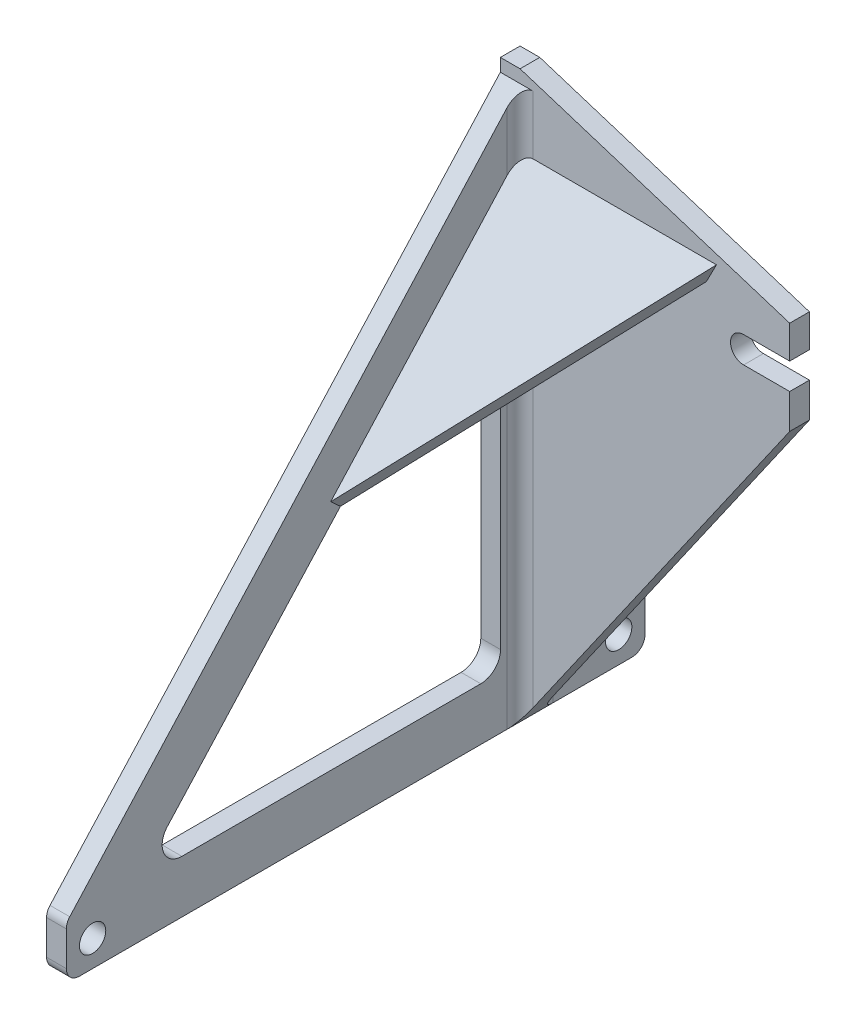
ISO-10303-21;
HEADER;
FILE_DESCRIPTION(('STEP AP214'),'2;1');
FILE_NAME('part.step','',(''),(''),'','','');
FILE_SCHEMA(('AUTOMOTIVE_DESIGN { 1 0 10303 214 1 1 1 1 }'));
ENDSEC;
DATA;
#1=APPLICATION_CONTEXT('core data for automotive mechanical design processes');
#2=APPLICATION_PROTOCOL_DEFINITION('international standard','automotive_design',2000,#1);
#3=PRODUCT_CONTEXT('',#1,'mechanical');
#4=PRODUCT('Part','Part','',(#3));
#5=PRODUCT_RELATED_PRODUCT_CATEGORY('part','',(#4));
#6=PRODUCT_DEFINITION_FORMATION('','',#4);
#7=PRODUCT_DEFINITION_CONTEXT('part definition',#1,'design');
#8=PRODUCT_DEFINITION('design','',#6,#7);
#9=PRODUCT_DEFINITION_SHAPE('','',#8);
#10=(LENGTH_UNIT() NAMED_UNIT(*) SI_UNIT(.MILLI.,.METRE.));
#11=(NAMED_UNIT(*) PLANE_ANGLE_UNIT() SI_UNIT($,.RADIAN.));
#12=(NAMED_UNIT(*) SI_UNIT($,.STERADIAN.) SOLID_ANGLE_UNIT());
#13=UNCERTAINTY_MEASURE_WITH_UNIT(LENGTH_MEASURE(1.E-05),#10,'distance_accuracy_value','');
#14=(GEOMETRIC_REPRESENTATION_CONTEXT(3) GLOBAL_UNCERTAINTY_ASSIGNED_CONTEXT((#13)) GLOBAL_UNIT_ASSIGNED_CONTEXT((#10,
#11,#12)) REPRESENTATION_CONTEXT('',''));
#15=CARTESIAN_POINT('',(0.,0.,0.));
#16=DIRECTION('',(0.,0.,1.));
#17=DIRECTION('',(1.,0.,0.));
#18=AXIS2_PLACEMENT_3D('',#15,#16,#17);
#19=CARTESIAN_POINT('',(5.,0.,-23.));
#20=DIRECTION('',(0.,1.,0.));
#21=DIRECTION('',(0.,0.,1.));
#22=AXIS2_PLACEMENT_3D('',#19,#20,#21);
#23=CYLINDRICAL_SURFACE('',#22,2.);
#24=CARTESIAN_POINT('',(5.,72.915420210866,-23.));
#25=DIRECTION('',(0.,-0.67195039672457,-0.740596154690053));
#26=DIRECTION('',(0.,0.740596154690053,-0.67195039672457));
#27=AXIS2_PLACEMENT_3D('',#24,#25,#26);
#28=ELLIPSE('',#27,2.97641017811586,2.);
#29=CARTESIAN_POINT('',(5.,75.1197381435589,-25.));
#30=VERTEX_POINT('',#29);
#31=CARTESIAN_POINT('',(3.,72.915420210866,-23.));
#32=VERTEX_POINT('',#31);
#33=EDGE_CURVE('E244',#30,#32,#28,.F.);
#34=ORIENTED_EDGE('',*,*,#33,.F.);
#35=DIRECTION('',(0.,1.,0.));
#36=VECTOR('',#35,1.);
#37=CARTESIAN_POINT('',(5.,0.,-25.));
#38=LINE('',#37,#36);
#39=CARTESIAN_POINT('',(5.,84.0489686779064,-25.));
#40=VERTEX_POINT('',#39);
#41=EDGE_CURVE('E362',#40,#30,#38,.F.);
#42=ORIENTED_EDGE('',*,*,#41,.F.);
#43=CARTESIAN_POINT('',(5.,81.8446507452135,-23.));
#44=DIRECTION('',(0.,-0.67195039672457,-0.740596154690053));
#45=DIRECTION('',(0.,0.740596154690053,-0.67195039672457));
#46=AXIS2_PLACEMENT_3D('',#43,#44,#45);
#47=ELLIPSE('',#46,2.97641017811586,2.);
#48=CARTESIAN_POINT('',(3.,81.8446507452135,-23.));
#49=VERTEX_POINT('',#48);
#50=EDGE_CURVE('E247',#49,#40,#47,.T.);
#51=ORIENTED_EDGE('',*,*,#50,.F.);
#52=DIRECTION('',(0.,1.,0.));
#53=VECTOR('',#52,1.);
#54=CARTESIAN_POINT('',(3.,0.,-23.));
#55=LINE('',#54,#53);
#56=EDGE_CURVE('E240',#32,#49,#55,.T.);
#57=ORIENTED_EDGE('',*,*,#56,.F.);
#58=EDGE_LOOP('',(#34,#42,#51,#57));
#59=FACE_BOUND('',#58,.T.);
#60=ADVANCED_FACE('F35',(#59),#23,.F.);
#61=CARTESIAN_POINT('',(44.,0.,0.));
#62=DIRECTION('',(1.,0.,0.));
#63=DIRECTION('',(0.,0.,-1.));
#64=AXIS2_PLACEMENT_3D('',#61,#62,#63);
#65=PLANE('',#64);
#66=DIRECTION('',(0.,0.,1.));
#67=VECTOR('',#66,1.);
#68=CARTESIAN_POINT('',(44.,58.7418641267568,0.));
#69=LINE('',#68,#67);
#70=CARTESIAN_POINT('',(44.,58.7418641267568,-28.));
#71=VERTEX_POINT('',#70);
#72=CARTESIAN_POINT('',(44.,58.7418641267568,-25.));
#73=VERTEX_POINT('',#72);
#74=EDGE_CURVE('E354',#71,#73,#69,.T.);
#75=ORIENTED_EDGE('',*,*,#74,.F.);
#76=DIRECTION('',(0.,1.,0.));
#77=VECTOR('',#76,1.);
#78=CARTESIAN_POINT('',(44.,0.,-28.));
#79=LINE('',#78,#77);
#80=CARTESIAN_POINT('',(44.,64.,-28.));
#81=VERTEX_POINT('',#80);
#82=EDGE_CURVE('E384',#71,#81,#79,.T.);
#83=ORIENTED_EDGE('',*,*,#82,.T.);
#84=DIRECTION('',(0.,0.,-1.));
#85=VECTOR('',#84,1.);
#86=CARTESIAN_POINT('',(44.,64.,0.));
#87=LINE('',#86,#85);
#88=CARTESIAN_POINT('',(44.,64.,-25.));
#89=VERTEX_POINT('',#88);
#90=EDGE_CURVE('E352',#89,#81,#87,.T.);
#91=ORIENTED_EDGE('',*,*,#90,.F.);
#92=DIRECTION('',(0.,-1.,0.));
#93=VECTOR('',#92,1.);
#94=CARTESIAN_POINT('',(44.,0.,-25.));
#95=LINE('',#94,#93);
#96=EDGE_CURVE('E549',#89,#73,#95,.T.);
#97=ORIENTED_EDGE('',*,*,#96,.T.);
#98=EDGE_LOOP('',(#75,#83,#91,#97));
#99=FACE_BOUND('',#98,.T.);
#100=ADVANCED_FACE('F465',(#99),#65,.T.);
#101=CARTESIAN_POINT('',(3.,0.,0.));
#102=DIRECTION('',(1.,0.,0.));
#103=DIRECTION('',(0.,0.,-1.));
#104=AXIS2_PLACEMENT_3D('',#101,#102,#103);
#105=PLANE('',#104);
#106=CARTESIAN_POINT('',(3.,4.,-40.));
#107=DIRECTION('',(1.,0.,0.));
#108=DIRECTION('',(0.,0.,1.));
#109=AXIS2_PLACEMENT_3D('',#106,#107,#108);
#110=CIRCLE('',#109,2.);
#111=CARTESIAN_POINT('',(3.,4.,-38.));
#112=VERTEX_POINT('',#111);
#113=EDGE_CURVE('E396',#112,#112,#110,.T.);
#114=ORIENTED_EDGE('',*,*,#113,.F.);
#115=EDGE_LOOP('',(#114));
#116=FACE_BOUND('',#115,.T.);
#117=DIRECTION('',(0.,1.,0.));
#118=VECTOR('',#117,1.);
#119=CARTESIAN_POINT('',(3.,8.,-44.));
#120=LINE('',#119,#118);
#121=CARTESIAN_POINT('',(3.,2.,-44.));
#122=VERTEX_POINT('',#121);
#123=CARTESIAN_POINT('',(3.,7.75394255745461,-44.));
#124=VERTEX_POINT('',#123);
#125=EDGE_CURVE('E317',#122,#124,#120,.T.);
#126=ORIENTED_EDGE('',*,*,#125,.T.);
#127=CARTESIAN_POINT('',(3.,7.75394255745461,-42.));
#128=DIRECTION('',(1.,0.,0.));
#129=DIRECTION('',(0.,0.,-1.));
#130=AXIS2_PLACEMENT_3D('',#127,#128,#129);
#131=CIRCLE('',#130,2.);
#132=CARTESIAN_POINT('',(3.,8.23871982175256,-43.9403584730714));
#133=VERTEX_POINT('',#132);
#134=EDGE_CURVE('E292',#124,#133,#131,.T.);
#135=ORIENTED_EDGE('',*,*,#134,.T.);
#136=DIRECTION('',(0.,0.970179236535677,0.242388632148973));
#137=VECTOR('',#136,1.);
#138=CARTESIAN_POINT('',(3.,84.0489686779064,-25.));
#139=LINE('',#138,#137);
#140=CARTESIAN_POINT('',(3.,64.0360821837205,-30.));
#141=VERTEX_POINT('',#140);
#142=EDGE_CURVE('E449',#133,#141,#139,.T.);
#143=ORIENTED_EDGE('',*,*,#142,.T.);
#144=DIRECTION('',(0.,-1.,0.));
#145=VECTOR('',#144,1.);
#146=CARTESIAN_POINT('',(3.,0.,-30.));
#147=LINE('',#146,#145);
#148=CARTESIAN_POINT('',(3.,0.,-30.));
#149=VERTEX_POINT('',#148);
#150=EDGE_CURVE('E356',#141,#149,#147,.T.);
#151=ORIENTED_EDGE('',*,*,#150,.T.);
#152=DIRECTION('',(0.,0.,-1.));
#153=VECTOR('',#152,1.);
#154=CARTESIAN_POINT('',(3.,0.,44.));
#155=LINE('',#154,#153);
#156=CARTESIAN_POINT('',(3.,0.,-42.));
#157=VERTEX_POINT('',#156);
#158=EDGE_CURVE('E318',#149,#157,#155,.T.);
#159=ORIENTED_EDGE('',*,*,#158,.T.);
#160=CARTESIAN_POINT('',(3.,2.,-42.));
#161=DIRECTION('',(1.,0.,0.));
#162=DIRECTION('',(0.,0.,-1.));
#163=AXIS2_PLACEMENT_3D('',#160,#161,#162);
#164=CIRCLE('',#163,2.);
#165=EDGE_CURVE('E290',#157,#122,#164,.T.);
#166=ORIENTED_EDGE('',*,*,#165,.T.);
#167=EDGE_LOOP('',(#126,#135,#143,#151,#159,#166));
#168=FACE_BOUND('',#167,.T.);
#169=ADVANCED_FACE('F471',(#116,#168),#105,.T.);
#170=DIRECTION('',(0.,-0.740596154690053,0.67195039672457));
#171=VECTOR('',#170,1.);
#172=CARTESIAN_POINT('',(3.,8.,44.));
#173=LINE('',#172,#171);
#174=CARTESIAN_POINT('',(3.,8.57180854802623,43.4811923093801));
#175=VERTEX_POINT('',#174);
#176=EDGE_CURVE('E337',#49,#175,#173,.T.);
#177=ORIENTED_EDGE('',*,*,#176,.T.);
#178=CARTESIAN_POINT('',(3.,7.22790775457709,42.));
#179=DIRECTION('',(1.,0.,0.));
#180=DIRECTION('',(0.,0.,-1.));
#181=AXIS2_PLACEMENT_3D('',#178,#179,#180);
#182=CIRCLE('',#181,2.);
#183=CARTESIAN_POINT('',(3.,7.22790775457709,44.));
#184=VERTEX_POINT('',#183);
#185=EDGE_CURVE('E11',#175,#184,#182,.T.);
#186=ORIENTED_EDGE('',*,*,#185,.T.);
#187=DIRECTION('',(0.,-1.,0.));
#188=VECTOR('',#187,1.);
#189=CARTESIAN_POINT('',(3.,8.,44.));
#190=LINE('',#189,#188);
#191=CARTESIAN_POINT('',(3.,2.,44.));
#192=VERTEX_POINT('',#191);
#193=EDGE_CURVE('E308',#184,#192,#190,.T.);
#194=ORIENTED_EDGE('',*,*,#193,.T.);
#195=CARTESIAN_POINT('',(3.,2.,42.));
#196=DIRECTION('',(1.,0.,0.));
#197=DIRECTION('',(0.,0.,-1.));
#198=AXIS2_PLACEMENT_3D('',#195,#196,#197);
#199=CIRCLE('',#198,2.);
#200=CARTESIAN_POINT('',(3.,0.,42.));
#201=VERTEX_POINT('',#200);
#202=EDGE_CURVE('E43',#192,#201,#199,.T.);
#203=ORIENTED_EDGE('',*,*,#202,.T.);
#204=CARTESIAN_POINT('',(3.,0.,-23.));
#205=VERTEX_POINT('',#204);
#206=EDGE_CURVE('E306',#201,#205,#155,.T.);
#207=ORIENTED_EDGE('',*,*,#206,.T.);
#208=CARTESIAN_POINT('',(3.,69.9390100327501,-23.));
#209=VERTEX_POINT('',#208);
#210=EDGE_CURVE('E249',#205,#209,#55,.T.);
#211=ORIENTED_EDGE('',*,*,#210,.T.);
#212=DIRECTION('',(0.,0.740596154690053,-0.67195039672457));
#213=VECTOR('',#212,1.);
#214=CARTESIAN_POINT('',(3.,20.1328662295635,22.1896190331675));
#215=LINE('',#214,#213);
#216=CARTESIAN_POINT('',(3.,63.1127273950972,-16.8064445818726));
#217=VERTEX_POINT('',#216);
#218=EDGE_CURVE('E502',#217,#209,#215,.T.);
#219=ORIENTED_EDGE('',*,*,#218,.F.);
#220=CARTESIAN_POINT('',(3.,61.0968762049235,-19.0282330459428));
#221=DIRECTION('',(1.,0.,0.));
#222=DIRECTION('',(0.,0.,-1.));
#223=AXIS2_PLACEMENT_3D('',#220,#221,#222);
#224=CIRCLE('',#223,3.);
#225=CARTESIAN_POINT('',(3.,61.0968762049235,-22.0282330459428));
#226=VERTEX_POINT('',#225);
#227=EDGE_CURVE('E417',#226,#217,#224,.T.);
#228=ORIENTED_EDGE('',*,*,#227,.F.);
#229=DIRECTION('',(0.,1.,0.));
#230=VECTOR('',#229,1.);
#231=CARTESIAN_POINT('',(3.,61.0968762049235,-22.0282330459428));
#232=LINE('',#231,#230);
#233=CARTESIAN_POINT('',(3.,11.,-22.0282330459428));
#234=VERTEX_POINT('',#233);
#235=EDGE_CURVE('E415',#234,#226,#232,.T.);
#236=ORIENTED_EDGE('',*,*,#235,.F.);
#237=CARTESIAN_POINT('',(3.,11.,-19.0282330459428));
#238=DIRECTION('',(1.,0.,0.));
#239=DIRECTION('',(0.,0.,-1.));
#240=AXIS2_PLACEMENT_3D('',#237,#238,#239);
#241=CIRCLE('',#240,3.);
#242=CARTESIAN_POINT('',(3.,8.,-19.0282330459428));
#243=VERTEX_POINT('',#242);
#244=EDGE_CURVE('E413',#243,#234,#241,.T.);
#245=ORIENTED_EDGE('',*,*,#244,.F.);
#246=DIRECTION('',(0.,0.,-1.));
#247=VECTOR('',#246,1.);
#248=CARTESIAN_POINT('',(3.,8.,-19.0282330459428));
#249=LINE('',#248,#247);
#250=CARTESIAN_POINT('',(3.,8.,26.425170441749));
#251=VERTEX_POINT('',#250);
#252=EDGE_CURVE('E410',#251,#243,#249,.T.);
#253=ORIENTED_EDGE('',*,*,#252,.F.);
#254=CARTESIAN_POINT('',(3.,11.,26.4251704417491));
#255=DIRECTION('',(1.,0.,0.));
#256=DIRECTION('',(0.,0.,-1.));
#257=AXIS2_PLACEMENT_3D('',#254,#255,#256);
#258=CIRCLE('',#257,3.);
#259=CARTESIAN_POINT('',(3.,13.0158511901738,28.6469589058192));
#260=VERTEX_POINT('',#259);
#261=EDGE_CURVE('E408',#260,#251,#258,.T.);
#262=ORIENTED_EDGE('',*,*,#261,.F.);
#263=DIRECTION('',(0.,-0.740596154690053,0.67195039672457));
#264=VECTOR('',#263,1.);
#265=CARTESIAN_POINT('',(3.,13.0158511901738,28.6469589058192));
#266=LINE('',#265,#264);
#267=CARTESIAN_POINT('',(3.,42.0391144329399,2.31385802929607));
#268=VERTEX_POINT('',#267);
#269=EDGE_CURVE('E420',#268,#260,#266,.T.);
#270=ORIENTED_EDGE('',*,*,#269,.F.);
#271=DIRECTION('',(0.,0.67195039672457,0.740596154690053));
#272=VECTOR('',#271,1.);
#273=CARTESIAN_POINT('',(3.,21.9062482033764,-19.8757610038714));
#274=LINE('',#273,#272);
#275=CARTESIAN_POINT('',(3.00000000000001,43.383015226389,3.79505033867617));
#276=VERTEX_POINT('',#275);
#277=EDGE_CURVE('E257',#276,#268,#274,.F.);
#278=ORIENTED_EDGE('',*,*,#277,.F.);
#279=DIRECTION('',(0.,0.740596154690053,-0.67195039672457));
#280=VECTOR('',#279,1.);
#281=CARTESIAN_POINT('',(3.,21.4767670230126,23.6708113425476));
#282=LINE('',#281,#280);
#283=EDGE_CURVE('E253',#276,#32,#282,.T.);
#284=ORIENTED_EDGE('',*,*,#283,.T.);
#285=ORIENTED_EDGE('',*,*,#56,.T.);
#286=EDGE_LOOP('',(#177,#186,#194,#203,#207,#211,#219,#228,#236,#245,#253,#262,#270,#278,#284,#285));
#287=FACE_BOUND('',#286,.T.);
#288=CARTESIAN_POINT('',(3.,4.,40.));
#289=DIRECTION('',(1.,0.,0.));
#290=DIRECTION('',(0.,0.,-1.));
#291=AXIS2_PLACEMENT_3D('',#288,#289,#290);
#292=CIRCLE('',#291,2.);
#293=CARTESIAN_POINT('',(3.,4.,38.));
#294=VERTEX_POINT('',#293);
#295=EDGE_CURVE('E402',#294,#294,#292,.T.);
#296=ORIENTED_EDGE('',*,*,#295,.F.);
#297=EDGE_LOOP('',(#296));
#298=FACE_BOUND('',#297,.T.);
#299=ADVANCED_FACE('F254',(#287,#298),#105,.T.);
#300=CARTESIAN_POINT('',(3.,84.0489686779064,-25.));
#301=DIRECTION('',(0.,-0.242388632148973,0.970179236535677));
#302=DIRECTION('',(0.,-0.970179236535677,-0.242388632148973));
#303=AXIS2_PLACEMENT_3D('',#300,#301,#302);
#304=PLANE('',#303);
#305=ORIENTED_EDGE('',*,*,#142,.F.);
#306=DIRECTION('',(-1.,0.,0.));
#307=VECTOR('',#306,1.);
#308=CARTESIAN_POINT('',(3.,8.23871982175256,-43.9403584730713));
#309=LINE('',#308,#307);
#310=CARTESIAN_POINT('',(0.,8.23871982175256,-43.9403584730714));
#311=VERTEX_POINT('',#310);
#312=EDGE_CURVE('E269',#133,#311,#309,.T.);
#313=ORIENTED_EDGE('',*,*,#312,.T.);
#314=DIRECTION('',(0.,0.970179236535677,0.242388632148973));
#315=VECTOR('',#314,1.);
#316=CARTESIAN_POINT('',(0.,84.0489686779064,-25.));
#317=LINE('',#316,#315);
#318=CARTESIAN_POINT('',(0.,72.0412367813949,-28.));
#319=VERTEX_POINT('',#318);
#320=EDGE_CURVE('E342',#311,#319,#317,.T.);
#321=ORIENTED_EDGE('',*,*,#320,.T.);
#322=DIRECTION('',(-1.,0.,0.));
#323=VECTOR('',#322,1.);
#324=CARTESIAN_POINT('',(3.,72.0412367813949,-28.));
#325=LINE('',#324,#323);
#326=CARTESIAN_POINT('',(5.,72.0412367813949,-28.));
#327=VERTEX_POINT('',#326);
#328=EDGE_CURVE('E349',#327,#319,#325,.T.);
#329=ORIENTED_EDGE('',*,*,#328,.F.);
#330=CARTESIAN_POINT('',(5.,64.0360821837205,-30.));
#331=DIRECTION('',(0.,-0.242388632148973,0.970179236535677));
#332=DIRECTION('',(0.,-0.970179236535677,-0.242388632148973));
#333=AXIS2_PLACEMENT_3D('',#330,#331,#332);
#334=ELLIPSE('',#333,8.25121204021973,2.);
#335=EDGE_CURVE('E366',#327,#141,#334,.T.);
#336=ORIENTED_EDGE('',*,*,#335,.T.);
#337=EDGE_LOOP('',(#305,#313,#321,#329,#336));
#338=FACE_BOUND('',#337,.T.);
#339=ADVANCED_FACE('F588',(#338),#304,.F.);
#340=CARTESIAN_POINT('',(0.,0.,0.));
#341=DIRECTION('',(1.,0.,0.));
#342=DIRECTION('',(0.,0.,-1.));
#343=AXIS2_PLACEMENT_3D('',#340,#341,#342);
#344=PLANE('',#343);
#345=DIRECTION('',(0.,-0.740596154690053,0.67195039672457));
#346=VECTOR('',#345,1.);
#347=CARTESIAN_POINT('',(0.,13.0158511901738,28.6469589058192));
#348=LINE('',#347,#346);
#349=CARTESIAN_POINT('',(0.,63.1127273950972,-16.8064445818726));
#350=VERTEX_POINT('',#349);
#351=CARTESIAN_POINT('',(0.,13.0158511901738,28.6469589058192));
#352=VERTEX_POINT('',#351);
#353=EDGE_CURVE('E411',#350,#352,#348,.T.);
#354=ORIENTED_EDGE('',*,*,#353,.T.);
#355=CARTESIAN_POINT('',(0.,11.,26.4251704417491));
#356=DIRECTION('',(1.,0.,0.));
#357=DIRECTION('',(0.,0.,-1.));
#358=AXIS2_PLACEMENT_3D('',#355,#356,#357);
#359=CIRCLE('',#358,3.);
#360=CARTESIAN_POINT('',(0.,8.,26.425170441749));
#361=VERTEX_POINT('',#360);
#362=EDGE_CURVE('E405',#352,#361,#359,.T.);
#363=ORIENTED_EDGE('',*,*,#362,.T.);
#364=DIRECTION('',(0.,0.,-1.));
#365=VECTOR('',#364,1.);
#366=CARTESIAN_POINT('',(0.,8.,-19.0282330459428));
#367=LINE('',#366,#365);
#368=CARTESIAN_POINT('',(0.,8.,-19.0282330459428));
#369=VERTEX_POINT('',#368);
#370=EDGE_CURVE('E425',#361,#369,#367,.T.);
#371=ORIENTED_EDGE('',*,*,#370,.T.);
#372=CARTESIAN_POINT('',(0.,11.,-19.0282330459428));
#373=DIRECTION('',(1.,0.,0.));
#374=DIRECTION('',(0.,0.,-1.));
#375=AXIS2_PLACEMENT_3D('',#372,#373,#374);
#376=CIRCLE('',#375,3.);
#377=CARTESIAN_POINT('',(0.,11.,-22.0282330459428));
#378=VERTEX_POINT('',#377);
#379=EDGE_CURVE('E428',#369,#378,#376,.T.);
#380=ORIENTED_EDGE('',*,*,#379,.T.);
#381=DIRECTION('',(0.,1.,0.));
#382=VECTOR('',#381,1.);
#383=CARTESIAN_POINT('',(0.,61.0968762049235,-22.0282330459428));
#384=LINE('',#383,#382);
#385=CARTESIAN_POINT('',(0.,61.0968762049235,-22.0282330459428));
#386=VERTEX_POINT('',#385);
#387=EDGE_CURVE('E431',#378,#386,#384,.T.);
#388=ORIENTED_EDGE('',*,*,#387,.T.);
#389=CARTESIAN_POINT('',(0.,61.0968762049235,-19.0282330459428));
#390=DIRECTION('',(1.,0.,0.));
#391=DIRECTION('',(0.,0.,-1.));
#392=AXIS2_PLACEMENT_3D('',#389,#390,#391);
#393=CIRCLE('',#392,3.);
#394=EDGE_CURVE('E434',#386,#350,#393,.T.);
#395=ORIENTED_EDGE('',*,*,#394,.T.);
#396=EDGE_LOOP('',(#354,#363,#371,#380,#388,#395));
#397=FACE_BOUND('',#396,.T.);
#398=ORIENTED_EDGE('',*,*,#320,.F.);
#399=CARTESIAN_POINT('',(0.,7.75394255745461,-42.));
#400=DIRECTION('',(1.,0.,0.));
#401=DIRECTION('',(0.,0.,-1.));
#402=AXIS2_PLACEMENT_3D('',#399,#400,#401);
#403=CIRCLE('',#402,2.);
#404=CARTESIAN_POINT('',(0.,7.75394255745461,-44.));
#405=VERTEX_POINT('',#404);
#406=EDGE_CURVE('E283',#311,#405,#403,.F.);
#407=ORIENTED_EDGE('',*,*,#406,.T.);
#408=DIRECTION('',(0.,1.,0.));
#409=VECTOR('',#408,1.);
#410=CARTESIAN_POINT('',(0.,8.,-44.));
#411=LINE('',#410,#409);
#412=CARTESIAN_POINT('',(0.,2.,-44.));
#413=VERTEX_POINT('',#412);
#414=EDGE_CURVE('E331',#413,#405,#411,.T.);
#415=ORIENTED_EDGE('',*,*,#414,.F.);
#416=CARTESIAN_POINT('',(0.,2.,-42.));
#417=DIRECTION('',(1.,0.,0.));
#418=DIRECTION('',(0.,0.,-1.));
#419=AXIS2_PLACEMENT_3D('',#416,#417,#418);
#420=CIRCLE('',#419,2.);
#421=CARTESIAN_POINT('',(0.,0.,-42.));
#422=VERTEX_POINT('',#421);
#423=EDGE_CURVE('E281',#413,#422,#420,.F.);
#424=ORIENTED_EDGE('',*,*,#423,.T.);
#425=DIRECTION('',(0.,0.,-1.));
#426=VECTOR('',#425,1.);
#427=CARTESIAN_POINT('',(0.,0.,44.));
#428=LINE('',#427,#426);
#429=CARTESIAN_POINT('',(0.,0.,42.));
#430=VERTEX_POINT('',#429);
#431=EDGE_CURVE('E326',#430,#422,#428,.T.);
#432=ORIENTED_EDGE('',*,*,#431,.F.);
#433=CARTESIAN_POINT('',(0.,2.,42.));
#434=DIRECTION('',(1.,0.,0.));
#435=DIRECTION('',(0.,0.,-1.));
#436=AXIS2_PLACEMENT_3D('',#433,#434,#435);
#437=CIRCLE('',#436,2.);
#438=CARTESIAN_POINT('',(0.,2.,44.));
#439=VERTEX_POINT('',#438);
#440=EDGE_CURVE('E277',#430,#439,#437,.F.);
#441=ORIENTED_EDGE('',*,*,#440,.T.);
#442=DIRECTION('',(0.,-1.,0.));
#443=VECTOR('',#442,1.);
#444=CARTESIAN_POINT('',(0.,8.,44.));
#445=LINE('',#444,#443);
#446=CARTESIAN_POINT('',(0.,7.22790775457709,44.));
#447=VERTEX_POINT('',#446);
#448=EDGE_CURVE('E325',#447,#439,#445,.T.);
#449=ORIENTED_EDGE('',*,*,#448,.F.);
#450=CARTESIAN_POINT('',(0.,7.22790775457709,42.));
#451=DIRECTION('',(1.,0.,0.));
#452=DIRECTION('',(0.,0.,-1.));
#453=AXIS2_PLACEMENT_3D('',#450,#451,#452);
#454=CIRCLE('',#453,2.);
#455=CARTESIAN_POINT('',(0.,8.57180854802623,43.4811923093801));
#456=VERTEX_POINT('',#455);
#457=EDGE_CURVE('E279',#447,#456,#454,.F.);
#458=ORIENTED_EDGE('',*,*,#457,.T.);
#459=DIRECTION('',(0.,-0.740596154690053,0.67195039672457));
#460=VECTOR('',#459,1.);
#461=CARTESIAN_POINT('',(0.,8.,44.));
#462=LINE('',#461,#460);
#463=CARTESIAN_POINT('',(0.,84.0489686779064,-25.));
#464=VERTEX_POINT('',#463);
#465=EDGE_CURVE('E344',#464,#456,#462,.T.);
#466=ORIENTED_EDGE('',*,*,#465,.F.);
#467=DIRECTION('',(0.,-1.,0.));
#468=VECTOR('',#467,1.);
#469=CARTESIAN_POINT('',(0.,0.,-25.));
#470=LINE('',#469,#468);
#471=CARTESIAN_POINT('',(0.,86.,-25.));
#472=VERTEX_POINT('',#471);
#473=EDGE_CURVE('E374',#472,#464,#470,.T.);
#474=ORIENTED_EDGE('',*,*,#473,.F.);
#475=DIRECTION('',(0.,0.,1.));
#476=VECTOR('',#475,1.);
#477=CARTESIAN_POINT('',(0.,86.,-28.));
#478=LINE('',#477,#476);
#479=CARTESIAN_POINT('',(0.,86.,-28.));
#480=VERTEX_POINT('',#479);
#481=EDGE_CURVE('E381',#480,#472,#478,.T.);
#482=ORIENTED_EDGE('',*,*,#481,.F.);
#483=DIRECTION('',(0.,1.,0.));
#484=VECTOR('',#483,1.);
#485=CARTESIAN_POINT('',(0.,0.,-28.));
#486=LINE('',#485,#484);
#487=EDGE_CURVE('E386',#319,#480,#486,.T.);
#488=ORIENTED_EDGE('',*,*,#487,.F.);
#489=EDGE_LOOP('',(#398,#407,#415,#424,#432,#441,#449,#458,#466,#474,#482,#488));
#490=FACE_BOUND('',#489,.T.);
#491=CARTESIAN_POINT('',(0.,4.,40.));
#492=DIRECTION('',(1.,0.,0.));
#493=DIRECTION('',(0.,0.,-1.));
#494=AXIS2_PLACEMENT_3D('',#491,#492,#493);
#495=CIRCLE('',#494,2.);
#496=CARTESIAN_POINT('',(0.,4.,38.));
#497=VERTEX_POINT('',#496);
#498=EDGE_CURVE('E399',#497,#497,#495,.T.);
#499=ORIENTED_EDGE('',*,*,#498,.T.);
#500=EDGE_LOOP('',(#499));
#501=FACE_BOUND('',#500,.T.);
#502=CARTESIAN_POINT('',(0.,4.,-40.));
#503=DIRECTION('',(1.,0.,0.));
#504=DIRECTION('',(0.,0.,1.));
#505=AXIS2_PLACEMENT_3D('',#502,#503,#504);
#506=CIRCLE('',#505,2.);
#507=CARTESIAN_POINT('',(0.,4.,-38.));
#508=VERTEX_POINT('',#507);
#509=EDGE_CURVE('E395',#508,#508,#506,.T.);
#510=ORIENTED_EDGE('',*,*,#509,.T.);
#511=EDGE_LOOP('',(#510));
#512=FACE_BOUND('',#511,.T.);
#513=ADVANCED_FACE('F323',(#397,#490,#501,#512),#344,.F.);
#514=CARTESIAN_POINT('',(3.,8.,44.));
#515=DIRECTION('',(0.,0.,-1.));
#516=DIRECTION('',(-1.,0.,0.));
#517=AXIS2_PLACEMENT_3D('',#514,#515,#516);
#518=PLANE('',#517);
#519=ORIENTED_EDGE('',*,*,#193,.F.);
#520=DIRECTION('',(-1.,0.,0.));
#521=VECTOR('',#520,1.);
#522=CARTESIAN_POINT('',(3.,7.22790775457709,44.));
#523=LINE('',#522,#521);
#524=EDGE_CURVE('E300',#184,#447,#523,.T.);
#525=ORIENTED_EDGE('',*,*,#524,.T.);
#526=ORIENTED_EDGE('',*,*,#448,.T.);
#527=DIRECTION('',(-1.,0.,0.));
#528=VECTOR('',#527,1.);
#529=CARTESIAN_POINT('',(3.,2.,44.));
#530=LINE('',#529,#528);
#531=EDGE_CURVE('E58',#439,#192,#530,.F.);
#532=ORIENTED_EDGE('',*,*,#531,.T.);
#533=EDGE_LOOP('',(#519,#525,#526,#532));
#534=FACE_BOUND('',#533,.T.);
#535=ADVANCED_FACE('F327',(#534),#518,.F.);
#536=CARTESIAN_POINT('',(3.,0.,44.));
#537=DIRECTION('',(0.,1.,0.));
#538=DIRECTION('',(0.,0.,1.));
#539=AXIS2_PLACEMENT_3D('',#536,#537,#538);
#540=PLANE('',#539);
#541=ORIENTED_EDGE('',*,*,#431,.T.);
#542=DIRECTION('',(-1.,0.,0.));
#543=VECTOR('',#542,1.);
#544=CARTESIAN_POINT('',(3.,0.,-42.));
#545=LINE('',#544,#543);
#546=EDGE_CURVE('E297',#422,#157,#545,.F.);
#547=ORIENTED_EDGE('',*,*,#546,.T.);
#548=ORIENTED_EDGE('',*,*,#158,.F.);
#549=DIRECTION('',(0.,0.,1.));
#550=VECTOR('',#549,1.);
#551=CARTESIAN_POINT('',(3.,0.,-28.));
#552=LINE('',#551,#550);
#553=EDGE_CURVE('E316',#149,#205,#552,.T.);
#554=ORIENTED_EDGE('',*,*,#553,.T.);
#555=ORIENTED_EDGE('',*,*,#206,.F.);
#556=DIRECTION('',(-1.,0.,0.));
#557=VECTOR('',#556,1.);
#558=CARTESIAN_POINT('',(3.,0.,42.));
#559=LINE('',#558,#557);
#560=EDGE_CURVE('E294',#201,#430,#559,.T.);
#561=ORIENTED_EDGE('',*,*,#560,.T.);
#562=EDGE_LOOP('',(#541,#547,#548,#554,#555,#561));
#563=FACE_BOUND('',#562,.T.);
#564=ADVANCED_FACE('F313',(#563),#540,.F.);
#565=CARTESIAN_POINT('',(3.,8.,-44.));
#566=DIRECTION('',(0.,0.,1.));
#567=DIRECTION('',(1.,0.,0.));
#568=AXIS2_PLACEMENT_3D('',#565,#566,#567);
#569=PLANE('',#568);
#570=ORIENTED_EDGE('',*,*,#414,.T.);
#571=DIRECTION('',(-1.,0.,0.));
#572=VECTOR('',#571,1.);
#573=CARTESIAN_POINT('',(3.,7.75394255745461,-44.));
#574=LINE('',#573,#572);
#575=EDGE_CURVE('E288',#405,#124,#574,.F.);
#576=ORIENTED_EDGE('',*,*,#575,.T.);
#577=ORIENTED_EDGE('',*,*,#125,.F.);
#578=DIRECTION('',(-1.,0.,0.));
#579=VECTOR('',#578,1.);
#580=CARTESIAN_POINT('',(3.,2.,-44.));
#581=LINE('',#580,#579);
#582=EDGE_CURVE('E285',#122,#413,#581,.T.);
#583=ORIENTED_EDGE('',*,*,#582,.T.);
#584=EDGE_LOOP('',(#570,#576,#577,#583));
#585=FACE_BOUND('',#584,.T.);
#586=ADVANCED_FACE('F594',(#585),#569,.F.);
#587=CARTESIAN_POINT('',(3.,8.,44.));
#588=DIRECTION('',(0.,-0.67195039672457,-0.740596154690053));
#589=DIRECTION('',(0.,0.740596154690053,-0.67195039672457));
#590=AXIS2_PLACEMENT_3D('',#587,#588,#589);
#591=PLANE('',#590);
#592=ORIENTED_EDGE('',*,*,#465,.T.);
#593=DIRECTION('',(-1.,0.,0.));
#594=VECTOR('',#593,1.);
#595=CARTESIAN_POINT('',(3.,8.57180854802623,43.4811923093801));
#596=LINE('',#595,#594);
#597=EDGE_CURVE('E50',#456,#175,#596,.F.);
#598=ORIENTED_EDGE('',*,*,#597,.T.);
#599=ORIENTED_EDGE('',*,*,#176,.F.);
#600=ORIENTED_EDGE('',*,*,#50,.T.);
#601=DIRECTION('',(-1.,0.,0.));
#602=VECTOR('',#601,1.);
#603=CARTESIAN_POINT('',(3.,84.0489686779064,-25.));
#604=LINE('',#603,#602);
#605=EDGE_CURVE('E346',#40,#464,#604,.T.);
#606=ORIENTED_EDGE('',*,*,#605,.T.);
#607=EDGE_LOOP('',(#592,#598,#599,#600,#606));
#608=FACE_BOUND('',#607,.T.);
#609=ADVANCED_FACE('F368',(#608),#591,.F.);
#610=CARTESIAN_POINT('',(3.,11.,26.4251704417491));
#611=DIRECTION('',(-1.,0.,0.));
#612=DIRECTION('',(0.,0.,1.));
#613=AXIS2_PLACEMENT_3D('',#610,#611,#612);
#614=CYLINDRICAL_SURFACE('',#613,3.);
#615=ORIENTED_EDGE('',*,*,#362,.F.);
#616=DIRECTION('',(-1.,0.,0.));
#617=VECTOR('',#616,1.);
#618=CARTESIAN_POINT('',(3.,13.0158511901738,28.6469589058192));
#619=LINE('',#618,#617);
#620=EDGE_CURVE('E422',#260,#352,#619,.T.);
#621=ORIENTED_EDGE('',*,*,#620,.F.);
#622=ORIENTED_EDGE('',*,*,#261,.T.);
#623=DIRECTION('',(-1.,0.,0.));
#624=VECTOR('',#623,1.);
#625=CARTESIAN_POINT('',(3.,8.,26.425170441749));
#626=LINE('',#625,#624);
#627=EDGE_CURVE('E329',#251,#361,#626,.T.);
#628=ORIENTED_EDGE('',*,*,#627,.T.);
#629=EDGE_LOOP('',(#615,#621,#622,#628));
#630=FACE_BOUND('',#629,.T.);
#631=ADVANCED_FACE('F610',(#630),#614,.F.);
#632=CARTESIAN_POINT('',(3.,8.,-19.0282330459428));
#633=DIRECTION('',(0.,1.,0.));
#634=DIRECTION('',(0.,0.,1.));
#635=AXIS2_PLACEMENT_3D('',#632,#633,#634);
#636=PLANE('',#635);
#637=ORIENTED_EDGE('',*,*,#370,.F.);
#638=ORIENTED_EDGE('',*,*,#627,.F.);
#639=ORIENTED_EDGE('',*,*,#252,.T.);
#640=DIRECTION('',(-1.,0.,0.));
#641=VECTOR('',#640,1.);
#642=CARTESIAN_POINT('',(3.,8.,-19.0282330459428));
#643=LINE('',#642,#641);
#644=EDGE_CURVE('E334',#243,#369,#643,.T.);
#645=ORIENTED_EDGE('',*,*,#644,.T.);
#646=EDGE_LOOP('',(#637,#638,#639,#645));
#647=FACE_BOUND('',#646,.T.);
#648=ADVANCED_FACE('F647',(#647),#636,.T.);
#649=CARTESIAN_POINT('',(3.,11.,-19.0282330459428));
#650=DIRECTION('',(-1.,0.,0.));
#651=DIRECTION('',(0.,0.,1.));
#652=AXIS2_PLACEMENT_3D('',#649,#650,#651);
#653=CYLINDRICAL_SURFACE('',#652,3.);
#654=ORIENTED_EDGE('',*,*,#379,.F.);
#655=ORIENTED_EDGE('',*,*,#644,.F.);
#656=ORIENTED_EDGE('',*,*,#244,.T.);
#657=DIRECTION('',(-1.,0.,0.));
#658=VECTOR('',#657,1.);
#659=CARTESIAN_POINT('',(3.,11.,-22.0282330459428));
#660=LINE('',#659,#658);
#661=EDGE_CURVE('E444',#234,#378,#660,.T.);
#662=ORIENTED_EDGE('',*,*,#661,.T.);
#663=EDGE_LOOP('',(#654,#655,#656,#662));
#664=FACE_BOUND('',#663,.T.);
#665=ADVANCED_FACE('F654',(#664),#653,.F.);
#666=CARTESIAN_POINT('',(3.,61.0968762049235,-22.0282330459428));
#667=DIRECTION('',(0.,0.,1.));
#668=DIRECTION('',(0.,-1.,0.));
#669=AXIS2_PLACEMENT_3D('',#666,#667,#668);
#670=PLANE('',#669);
#671=ORIENTED_EDGE('',*,*,#387,.F.);
#672=ORIENTED_EDGE('',*,*,#661,.F.);
#673=ORIENTED_EDGE('',*,*,#235,.T.);
#674=DIRECTION('',(-1.,0.,0.));
#675=VECTOR('',#674,1.);
#676=CARTESIAN_POINT('',(3.,61.0968762049235,-22.0282330459428));
#677=LINE('',#676,#675);
#678=EDGE_CURVE('E442',#226,#386,#677,.T.);
#679=ORIENTED_EDGE('',*,*,#678,.T.);
#680=EDGE_LOOP('',(#671,#672,#673,#679));
#681=FACE_BOUND('',#680,.T.);
#682=ADVANCED_FACE('F661',(#681),#670,.T.);
#683=CARTESIAN_POINT('',(3.,61.0968762049235,-19.0282330459428));
#684=DIRECTION('',(-1.,0.,0.));
#685=DIRECTION('',(0.,0.,1.));
#686=AXIS2_PLACEMENT_3D('',#683,#684,#685);
#687=CYLINDRICAL_SURFACE('',#686,3.);
#688=ORIENTED_EDGE('',*,*,#394,.F.);
#689=ORIENTED_EDGE('',*,*,#678,.F.);
#690=ORIENTED_EDGE('',*,*,#227,.T.);
#691=DIRECTION('',(-1.,0.,0.));
#692=VECTOR('',#691,1.);
#693=CARTESIAN_POINT('',(3.,63.1127273950972,-16.8064445818726));
#694=LINE('',#693,#692);
#695=EDGE_CURVE('E440',#217,#350,#694,.T.);
#696=ORIENTED_EDGE('',*,*,#695,.T.);
#697=EDGE_LOOP('',(#688,#689,#690,#696));
#698=FACE_BOUND('',#697,.T.);
#699=ADVANCED_FACE('F669',(#698),#687,.F.);
#700=CARTESIAN_POINT('',(3.,13.0158511901738,28.6469589058192));
#701=DIRECTION('',(0.,-0.67195039672457,-0.740596154690053));
#702=DIRECTION('',(0.,0.740596154690053,-0.67195039672457));
#703=AXIS2_PLACEMENT_3D('',#700,#701,#702);
#704=PLANE('',#703);
#705=ORIENTED_EDGE('',*,*,#695,.F.);
#706=ORIENTED_EDGE('',*,*,#218,.T.);
#707=CARTESIAN_POINT('',(5.,69.9390100327501,-23.));
#708=DIRECTION('',(0.,-0.67195039672457,-0.740596154690053));
#709=DIRECTION('',(0.,0.740596154690053,-0.67195039672457));
#710=AXIS2_PLACEMENT_3D('',#707,#708,#709);
#711=ELLIPSE('',#710,2.97641017811586,2.);
#712=CARTESIAN_POINT('',(5.,72.1433279654431,-25.));
#713=VERTEX_POINT('',#712);
#714=EDGE_CURVE('E266',#713,#209,#711,.F.);
#715=ORIENTED_EDGE('',*,*,#714,.F.);
#716=DIRECTION('',(-1.,0.,0.));
#717=VECTOR('',#716,1.);
#718=CARTESIAN_POINT('',(44.,72.1433279654431,-25.));
#719=LINE('',#718,#717);
#720=CARTESIAN_POINT('',(31.3338238085246,72.1433279654431,-25.));
#721=VERTEX_POINT('',#720);
#722=EDGE_CURVE('E261',#721,#713,#719,.T.);
#723=ORIENTED_EDGE('',*,*,#722,.F.);
#724=DIRECTION('',(0.571832945573338,0.607562933079326,-0.551248006531513));
#725=VECTOR('',#724,1.);
#726=CARTESIAN_POINT('',(3.,42.0391144329398,2.31385802929608));
#727=LINE('',#726,#725);
#728=EDGE_CURVE('E904',#268,#721,#727,.T.);
#729=ORIENTED_EDGE('',*,*,#728,.F.);
#730=ORIENTED_EDGE('',*,*,#269,.T.);
#731=ORIENTED_EDGE('',*,*,#620,.T.);
#732=ORIENTED_EDGE('',*,*,#353,.F.);
#733=EDGE_LOOP('',(#705,#706,#715,#723,#729,#730,#731,#732));
#734=FACE_BOUND('',#733,.T.);
#735=ADVANCED_FACE('F499',(#734),#704,.T.);
#736=CARTESIAN_POINT('',(3.,4.,40.));
#737=DIRECTION('',(-1.,0.,0.));
#738=DIRECTION('',(0.,0.,1.));
#739=AXIS2_PLACEMENT_3D('',#736,#737,#738);
#740=CYLINDRICAL_SURFACE('',#739,2.);
#741=ORIENTED_EDGE('',*,*,#295,.T.);
#742=EDGE_LOOP('',(#741));
#743=FACE_BOUND('',#742,.T.);
#744=ORIENTED_EDGE('',*,*,#498,.F.);
#745=EDGE_LOOP('',(#744));
#746=FACE_BOUND('',#745,.T.);
#747=ADVANCED_FACE('F685',(#743,#746),#740,.F.);
#748=CARTESIAN_POINT('',(3.,4.,-40.));
#749=DIRECTION('',(-1.,0.,0.));
#750=DIRECTION('',(0.,0.,1.));
#751=AXIS2_PLACEMENT_3D('',#748,#749,#750);
#752=CYLINDRICAL_SURFACE('',#751,2.);
#753=ORIENTED_EDGE('',*,*,#113,.T.);
#754=EDGE_LOOP('',(#753));
#755=FACE_BOUND('',#754,.T.);
#756=ORIENTED_EDGE('',*,*,#509,.F.);
#757=EDGE_LOOP('',(#756));
#758=FACE_BOUND('',#757,.T.);
#759=ADVANCED_FACE('F692',(#755,#758),#752,.F.);
#760=CARTESIAN_POINT('',(44.,0.,-28.));
#761=DIRECTION('',(0.,0.,1.));
#762=DIRECTION('',(0.,-1.,0.));
#763=AXIS2_PLACEMENT_3D('',#760,#761,#762);
#764=PLANE('',#763);
#765=DIRECTION('',(0.953230637699318,-0.30224386073393,0.));
#766=VECTOR('',#765,1.);
#767=CARTESIAN_POINT('',(3.,86.,-28.));
#768=LINE('',#767,#766);
#769=CARTESIAN_POINT('',(3.,86.,-28.));
#770=VERTEX_POINT('',#769);
#771=CARTESIAN_POINT('',(44.,73.,-28.));
#772=VERTEX_POINT('',#771);
#773=EDGE_CURVE('E512',#770,#772,#768,.T.);
#774=ORIENTED_EDGE('',*,*,#773,.T.);
#775=CARTESIAN_POINT('',(44.,68.,-28.));
#776=VERTEX_POINT('',#775);
#777=EDGE_CURVE('E380',#776,#772,#79,.T.);
#778=ORIENTED_EDGE('',*,*,#777,.F.);
#779=DIRECTION('',(-1.,0.,0.));
#780=VECTOR('',#779,1.);
#781=CARTESIAN_POINT('',(44.,68.,-28.));
#782=LINE('',#781,#780);
#783=CARTESIAN_POINT('',(37.,68.,-28.));
#784=VERTEX_POINT('',#783);
#785=EDGE_CURVE('E514',#776,#784,#782,.T.);
#786=ORIENTED_EDGE('',*,*,#785,.T.);
#787=CARTESIAN_POINT('',(37.,66.,-28.));
#788=DIRECTION('',(0.,0.,1.));
#789=DIRECTION('',(1.,0.,0.));
#790=AXIS2_PLACEMENT_3D('',#787,#788,#789);
#791=CIRCLE('',#790,1.99999999999999);
#792=CARTESIAN_POINT('',(37.,64.,-28.));
#793=VERTEX_POINT('',#792);
#794=EDGE_CURVE('E518',#784,#793,#791,.T.);
#795=ORIENTED_EDGE('',*,*,#794,.T.);
#796=DIRECTION('',(1.,0.,0.));
#797=VECTOR('',#796,1.);
#798=CARTESIAN_POINT('',(37.,64.,-28.));
#799=LINE('',#798,#797);
#800=EDGE_CURVE('E521',#793,#81,#799,.T.);
#801=ORIENTED_EDGE('',*,*,#800,.T.);
#802=ORIENTED_EDGE('',*,*,#82,.F.);
#803=DIRECTION('',(-0.572344059011875,-0.820013584103221,0.));
#804=VECTOR('',#803,1.);
#805=CARTESIAN_POINT('',(3.,0.,-28.));
#806=LINE('',#805,#804);
#807=CARTESIAN_POINT('',(5.,2.86545678667106,-28.));
#808=VERTEX_POINT('',#807);
#809=EDGE_CURVE('E524',#71,#808,#806,.T.);
#810=ORIENTED_EDGE('',*,*,#809,.T.);
#811=DIRECTION('',(0.,-1.,0.));
#812=VECTOR('',#811,1.);
#813=CARTESIAN_POINT('',(5.,0.,-28.));
#814=LINE('',#813,#812);
#815=EDGE_CURVE('E250',#808,#327,#814,.F.);
#816=ORIENTED_EDGE('',*,*,#815,.T.);
#817=ORIENTED_EDGE('',*,*,#328,.T.);
#818=ORIENTED_EDGE('',*,*,#487,.T.);
#819=DIRECTION('',(-1.,0.,0.));
#820=VECTOR('',#819,1.);
#821=CARTESIAN_POINT('',(44.,86.,-28.));
#822=LINE('',#821,#820);
#823=EDGE_CURVE('E391',#770,#480,#822,.T.);
#824=ORIENTED_EDGE('',*,*,#823,.F.);
#825=EDGE_LOOP('',(#774,#778,#786,#795,#801,#802,#810,#816,#817,#818,#824));
#826=FACE_BOUND('',#825,.T.);
#827=ADVANCED_FACE('F554',(#826),#764,.F.);
#828=CARTESIAN_POINT('',(44.,86.,-28.));
#829=DIRECTION('',(0.,-1.,0.));
#830=DIRECTION('',(0.,0.,-1.));
#831=AXIS2_PLACEMENT_3D('',#828,#829,#830);
#832=PLANE('',#831);
#833=DIRECTION('',(-1.,0.,0.));
#834=VECTOR('',#833,1.);
#835=CARTESIAN_POINT('',(44.,86.,-25.));
#836=LINE('',#835,#834);
#837=CARTESIAN_POINT('',(3.,86.,-25.));
#838=VERTEX_POINT('',#837);
#839=EDGE_CURVE('E377',#838,#472,#836,.T.);
#840=ORIENTED_EDGE('',*,*,#839,.F.);
#841=DIRECTION('',(0.,0.,1.));
#842=VECTOR('',#841,1.);
#843=CARTESIAN_POINT('',(3.,86.,-28.));
#844=LINE('',#843,#842);
#845=EDGE_CURVE('E527',#770,#838,#844,.T.);
#846=ORIENTED_EDGE('',*,*,#845,.F.);
#847=ORIENTED_EDGE('',*,*,#823,.T.);
#848=ORIENTED_EDGE('',*,*,#481,.T.);
#849=EDGE_LOOP('',(#840,#846,#847,#848));
#850=FACE_BOUND('',#849,.T.);
#851=ADVANCED_FACE('F557',(#850),#832,.F.);
#852=CARTESIAN_POINT('',(44.,0.,-25.));
#853=DIRECTION('',(0.,0.,-1.));
#854=DIRECTION('',(-1.,0.,0.));
#855=AXIS2_PLACEMENT_3D('',#852,#853,#854);
#856=PLANE('',#855);
#857=DIRECTION('',(0.45871173696779,0.88858513512662,0.));
#858=VECTOR('',#857,1.);
#859=CARTESIAN_POINT('',(4.5930556047151,20.3429330489289,-25.));
#860=LINE('',#859,#858);
#861=CARTESIAN_POINT('',(32.8703274352003,75.1197381435589,-25.));
#862=VERTEX_POINT('',#861);
#863=EDGE_CURVE('E505',#862,#721,#860,.F.);
#864=ORIENTED_EDGE('',*,*,#863,.T.);
#865=ORIENTED_EDGE('',*,*,#722,.T.);
#866=CARTESIAN_POINT('',(5.,2.86545678667106,-25.));
#867=VERTEX_POINT('',#866);
#868=EDGE_CURVE('E361',#713,#867,#38,.F.);
#869=ORIENTED_EDGE('',*,*,#868,.T.);
#870=DIRECTION('',(-0.572344059011875,-0.820013584103221,0.));
#871=VECTOR('',#870,1.);
#872=CARTESIAN_POINT('',(3.,0.,-25.));
#873=LINE('',#872,#871);
#874=EDGE_CURVE('E515',#73,#867,#873,.T.);
#875=ORIENTED_EDGE('',*,*,#874,.F.);
#876=ORIENTED_EDGE('',*,*,#96,.F.);
#877=DIRECTION('',(1.,0.,0.));
#878=VECTOR('',#877,1.);
#879=CARTESIAN_POINT('',(44.,64.,-25.));
#880=LINE('',#879,#878);
#881=CARTESIAN_POINT('',(37.,64.,-25.));
#882=VERTEX_POINT('',#881);
#883=EDGE_CURVE('E535',#882,#89,#880,.T.);
#884=ORIENTED_EDGE('',*,*,#883,.F.);
#885=CARTESIAN_POINT('',(37.,66.,-25.));
#886=DIRECTION('',(0.,0.,1.));
#887=DIRECTION('',(1.,0.,0.));
#888=AXIS2_PLACEMENT_3D('',#885,#886,#887);
#889=CIRCLE('',#888,1.99999999999999);
#890=CARTESIAN_POINT('',(37.,68.,-25.));
#891=VERTEX_POINT('',#890);
#892=EDGE_CURVE('E532',#891,#882,#889,.T.);
#893=ORIENTED_EDGE('',*,*,#892,.F.);
#894=DIRECTION('',(-1.,0.,0.));
#895=VECTOR('',#894,1.);
#896=CARTESIAN_POINT('',(44.,68.,-25.));
#897=LINE('',#896,#895);
#898=CARTESIAN_POINT('',(44.,68.,-25.));
#899=VERTEX_POINT('',#898);
#900=EDGE_CURVE('E529',#899,#891,#897,.T.);
#901=ORIENTED_EDGE('',*,*,#900,.F.);
#902=CARTESIAN_POINT('',(44.,73.,-25.));
#903=VERTEX_POINT('',#902);
#904=EDGE_CURVE('E392',#903,#899,#95,.T.);
#905=ORIENTED_EDGE('',*,*,#904,.F.);
#906=DIRECTION('',(0.953230637699318,-0.30224386073393,0.));
#907=VECTOR('',#906,1.);
#908=CARTESIAN_POINT('',(3.,86.,-25.));
#909=LINE('',#908,#907);
#910=EDGE_CURVE('E511',#838,#903,#909,.T.);
#911=ORIENTED_EDGE('',*,*,#910,.F.);
#912=ORIENTED_EDGE('',*,*,#839,.T.);
#913=ORIENTED_EDGE('',*,*,#473,.T.);
#914=ORIENTED_EDGE('',*,*,#605,.F.);
#915=ORIENTED_EDGE('',*,*,#41,.T.);
#916=DIRECTION('',(-1.,0.,0.));
#917=VECTOR('',#916,1.);
#918=CARTESIAN_POINT('',(44.,75.1197381435589,-25.));
#919=LINE('',#918,#917);
#920=EDGE_CURVE('E262',#862,#30,#919,.T.);
#921=ORIENTED_EDGE('',*,*,#920,.F.);
#922=EDGE_LOOP('',(#864,#865,#869,#875,#876,#884,#893,#901,#905,#911,#912,#913,#914,#915,#921));
#923=FACE_BOUND('',#922,.T.);
#924=ADVANCED_FACE('F371',(#923),#856,.F.);
#925=DIRECTION('',(0.,0.,1.));
#926=VECTOR('',#925,1.);
#927=CARTESIAN_POINT('',(44.,68.,-28.));
#928=LINE('',#927,#926);
#929=EDGE_CURVE('E543',#776,#899,#928,.T.);
#930=ORIENTED_EDGE('',*,*,#929,.F.);
#931=ORIENTED_EDGE('',*,*,#777,.T.);
#932=DIRECTION('',(0.,0.,1.));
#933=VECTOR('',#932,1.);
#934=CARTESIAN_POINT('',(44.,73.,-28.));
#935=LINE('',#934,#933);
#936=EDGE_CURVE('E545',#772,#903,#935,.T.);
#937=ORIENTED_EDGE('',*,*,#936,.T.);
#938=ORIENTED_EDGE('',*,*,#904,.T.);
#939=EDGE_LOOP('',(#930,#931,#937,#938));
#940=FACE_BOUND('',#939,.T.);
#941=ADVANCED_FACE('F474',(#940),#65,.T.);
#942=CARTESIAN_POINT('',(3.,86.,-28.));
#943=DIRECTION('',(-0.30224386073393,-0.953230637699318,0.));
#944=DIRECTION('',(0.953230637699318,-0.30224386073393,0.));
#945=AXIS2_PLACEMENT_3D('',#942,#943,#944);
#946=PLANE('',#945);
#947=ORIENTED_EDGE('',*,*,#936,.F.);
#948=ORIENTED_EDGE('',*,*,#773,.F.);
#949=ORIENTED_EDGE('',*,*,#845,.T.);
#950=ORIENTED_EDGE('',*,*,#910,.T.);
#951=EDGE_LOOP('',(#947,#948,#949,#950));
#952=FACE_BOUND('',#951,.T.);
#953=ADVANCED_FACE('F560',(#952),#946,.F.);
#954=CARTESIAN_POINT('',(44.,64.,-28.));
#955=DIRECTION('',(0.,-1.,0.));
#956=DIRECTION('',(0.,0.,-1.));
#957=AXIS2_PLACEMENT_3D('',#954,#955,#956);
#958=PLANE('',#957);
#959=ORIENTED_EDGE('',*,*,#90,.T.);
#960=ORIENTED_EDGE('',*,*,#800,.F.);
#961=DIRECTION('',(0.,0.,1.));
#962=VECTOR('',#961,1.);
#963=CARTESIAN_POINT('',(37.,64.,-28.));
#964=LINE('',#963,#962);
#965=EDGE_CURVE('E539',#793,#882,#964,.T.);
#966=ORIENTED_EDGE('',*,*,#965,.T.);
#967=ORIENTED_EDGE('',*,*,#883,.T.);
#968=EDGE_LOOP('',(#959,#960,#966,#967));
#969=FACE_BOUND('',#968,.T.);
#970=ADVANCED_FACE('F576',(#969),#958,.F.);
#971=CARTESIAN_POINT('',(44.,68.,-28.));
#972=DIRECTION('',(0.,1.,0.));
#973=DIRECTION('',(0.,0.,1.));
#974=AXIS2_PLACEMENT_3D('',#971,#972,#973);
#975=PLANE('',#974);
#976=ORIENTED_EDGE('',*,*,#900,.T.);
#977=DIRECTION('',(0.,0.,1.));
#978=VECTOR('',#977,1.);
#979=CARTESIAN_POINT('',(37.,68.,-28.));
#980=LINE('',#979,#978);
#981=EDGE_CURVE('E541',#784,#891,#980,.T.);
#982=ORIENTED_EDGE('',*,*,#981,.F.);
#983=ORIENTED_EDGE('',*,*,#785,.F.);
#984=ORIENTED_EDGE('',*,*,#929,.T.);
#985=EDGE_LOOP('',(#976,#982,#983,#984));
#986=FACE_BOUND('',#985,.T.);
#987=ADVANCED_FACE('F570',(#986),#975,.F.);
#988=CARTESIAN_POINT('',(37.,66.,-28.));
#989=DIRECTION('',(0.,0.,1.));
#990=DIRECTION('',(1.,0.,0.));
#991=AXIS2_PLACEMENT_3D('',#988,#989,#990);
#992=CYLINDRICAL_SURFACE('',#991,1.99999999999999);
#993=ORIENTED_EDGE('',*,*,#892,.T.);
#994=ORIENTED_EDGE('',*,*,#965,.F.);
#995=ORIENTED_EDGE('',*,*,#794,.F.);
#996=ORIENTED_EDGE('',*,*,#981,.T.);
#997=EDGE_LOOP('',(#993,#994,#995,#996));
#998=FACE_BOUND('',#997,.T.);
#999=ADVANCED_FACE('F572',(#998),#992,.F.);
#1000=CARTESIAN_POINT('',(3.,0.,-28.));
#1001=DIRECTION('',(-0.820013584103221,0.572344059011875,0.));
#1002=DIRECTION('',(-0.572344059011875,-0.820013584103221,0.));
#1003=AXIS2_PLACEMENT_3D('',#1000,#1001,#1002);
#1004=PLANE('',#1003);
#1005=ORIENTED_EDGE('',*,*,#74,.T.);
#1006=ORIENTED_EDGE('',*,*,#874,.T.);
#1007=CARTESIAN_POINT('',(5.,2.86545678667106,-23.));
#1008=DIRECTION('',(-0.820013584103221,0.572344059011875,0.));
#1009=DIRECTION('',(0.572344059011875,0.820013584103221,0.));
#1010=AXIS2_PLACEMENT_3D('',#1007,#1008,#1009);
#1011=ELLIPSE('',#1010,3.49440160775479,2.);
#1012=EDGE_CURVE('E267',#867,#205,#1011,.T.);
#1013=ORIENTED_EDGE('',*,*,#1012,.T.);
#1014=ORIENTED_EDGE('',*,*,#553,.F.);
#1015=CARTESIAN_POINT('',(5.,2.86545678667106,-30.));
#1016=DIRECTION('',(-0.820013584103221,0.572344059011875,0.));
#1017=DIRECTION('',(-0.572344059011875,-0.820013584103221,0.));
#1018=AXIS2_PLACEMENT_3D('',#1015,#1016,#1017);
#1019=ELLIPSE('',#1018,3.49440160775479,2.);
#1020=EDGE_CURVE('E364',#149,#808,#1019,.T.);
#1021=ORIENTED_EDGE('',*,*,#1020,.T.);
#1022=ORIENTED_EDGE('',*,*,#809,.F.);
#1023=EDGE_LOOP('',(#1005,#1006,#1013,#1014,#1021,#1022));
#1024=FACE_BOUND('',#1023,.T.);
#1025=ADVANCED_FACE('F487',(#1024),#1004,.F.);
#1026=CARTESIAN_POINT('',(5.,0.,-30.));
#1027=DIRECTION('',(0.,-1.,0.));
#1028=DIRECTION('',(0.,0.,-1.));
#1029=AXIS2_PLACEMENT_3D('',#1026,#1027,#1028);
#1030=CYLINDRICAL_SURFACE('',#1029,2.);
#1031=ORIENTED_EDGE('',*,*,#335,.F.);
#1032=ORIENTED_EDGE('',*,*,#815,.F.);
#1033=ORIENTED_EDGE('',*,*,#1020,.F.);
#1034=ORIENTED_EDGE('',*,*,#150,.F.);
#1035=EDGE_LOOP('',(#1031,#1032,#1033,#1034));
#1036=FACE_BOUND('',#1035,.T.);
#1037=ADVANCED_FACE('F479',(#1036),#1030,.F.);
#1038=ORIENTED_EDGE('',*,*,#868,.F.);
#1039=ORIENTED_EDGE('',*,*,#714,.T.);
#1040=ORIENTED_EDGE('',*,*,#210,.F.);
#1041=ORIENTED_EDGE('',*,*,#1012,.F.);
#1042=EDGE_LOOP('',(#1038,#1039,#1040,#1041));
#1043=FACE_BOUND('',#1042,.T.);
#1044=ADVANCED_FACE('F467',(#1043),#23,.F.);
#1045=CARTESIAN_POINT('',(3.,42.0391144329398,2.31385802929608));
#1046=DIRECTION('',(-0.820370088653237,0.4234972806167,-0.384243374638183));
#1047=DIRECTION('',(0.571832945573338,0.607562933079326,-0.551248006531513));
#1048=AXIS2_PLACEMENT_3D('',#1045,#1046,#1047);
#1049=PLANE('',#1048);
#1050=DIRECTION('',(0.571832945573338,0.607562933079326,-0.551248006531513));
#1051=VECTOR('',#1050,1.);
#1052=CARTESIAN_POINT('',(3.,43.383015226389,3.79505033867619));
#1053=LINE('',#1052,#1051);
#1054=EDGE_CURVE('E905',#276,#862,#1053,.T.);
#1055=ORIENTED_EDGE('',*,*,#1054,.F.);
#1056=ORIENTED_EDGE('',*,*,#277,.T.);
#1057=ORIENTED_EDGE('',*,*,#728,.T.);
#1058=ORIENTED_EDGE('',*,*,#863,.F.);
#1059=EDGE_LOOP('',(#1055,#1056,#1057,#1058));
#1060=FACE_BOUND('',#1059,.T.);
#1061=ADVANCED_FACE('F478',(#1060),#1049,.F.);
#1062=CARTESIAN_POINT('',(22.,45.0615215897054,2.27212450441066));
#1063=DIRECTION('',(0.,-0.67195039672457,-0.740596154690053));
#1064=DIRECTION('',(0.,0.740596154690053,-0.67195039672457));
#1065=AXIS2_PLACEMENT_3D('',#1062,#1063,#1064);
#1066=PLANE('',#1065);
#1067=ORIENTED_EDGE('',*,*,#283,.F.);
#1068=ORIENTED_EDGE('',*,*,#1054,.T.);
#1069=ORIENTED_EDGE('',*,*,#920,.T.);
#1070=ORIENTED_EDGE('',*,*,#33,.T.);
#1071=EDGE_LOOP('',(#1067,#1068,#1069,#1070));
#1072=FACE_BOUND('',#1071,.T.);
#1073=ADVANCED_FACE('F265',(#1072),#1066,.F.);
#1074=CARTESIAN_POINT('',(3.,7.75394255745461,-42.));
#1075=DIRECTION('',(-1.,0.,0.));
#1076=DIRECTION('',(0.,0.,1.));
#1077=AXIS2_PLACEMENT_3D('',#1074,#1075,#1076);
#1078=CYLINDRICAL_SURFACE('',#1077,2.);
#1079=ORIENTED_EDGE('',*,*,#134,.F.);
#1080=ORIENTED_EDGE('',*,*,#575,.F.);
#1081=ORIENTED_EDGE('',*,*,#406,.F.);
#1082=ORIENTED_EDGE('',*,*,#312,.F.);
#1083=EDGE_LOOP('',(#1079,#1080,#1081,#1082));
#1084=FACE_BOUND('',#1083,.T.);
#1085=ADVANCED_FACE('F461',(#1084),#1078,.T.);
#1086=CARTESIAN_POINT('',(3.,2.,-42.));
#1087=DIRECTION('',(-1.,0.,0.));
#1088=DIRECTION('',(0.,0.,1.));
#1089=AXIS2_PLACEMENT_3D('',#1086,#1087,#1088);
#1090=CYLINDRICAL_SURFACE('',#1089,2.);
#1091=ORIENTED_EDGE('',*,*,#165,.F.);
#1092=ORIENTED_EDGE('',*,*,#546,.F.);
#1093=ORIENTED_EDGE('',*,*,#423,.F.);
#1094=ORIENTED_EDGE('',*,*,#582,.F.);
#1095=EDGE_LOOP('',(#1091,#1092,#1093,#1094));
#1096=FACE_BOUND('',#1095,.T.);
#1097=ADVANCED_FACE('F456',(#1096),#1090,.T.);
#1098=CARTESIAN_POINT('',(3.,7.22790775457709,42.));
#1099=DIRECTION('',(-1.,0.,0.));
#1100=DIRECTION('',(0.,0.,1.));
#1101=AXIS2_PLACEMENT_3D('',#1098,#1099,#1100);
#1102=CYLINDRICAL_SURFACE('',#1101,2.);
#1103=ORIENTED_EDGE('',*,*,#185,.F.);
#1104=ORIENTED_EDGE('',*,*,#597,.F.);
#1105=ORIENTED_EDGE('',*,*,#457,.F.);
#1106=ORIENTED_EDGE('',*,*,#524,.F.);
#1107=EDGE_LOOP('',(#1103,#1104,#1105,#1106));
#1108=FACE_BOUND('',#1107,.T.);
#1109=ADVANCED_FACE('F454',(#1108),#1102,.T.);
#1110=CARTESIAN_POINT('',(3.,2.,42.));
#1111=DIRECTION('',(-1.,0.,0.));
#1112=DIRECTION('',(0.,0.,1.));
#1113=AXIS2_PLACEMENT_3D('',#1110,#1111,#1112);
#1114=CYLINDRICAL_SURFACE('',#1113,2.);
#1115=ORIENTED_EDGE('',*,*,#202,.F.);
#1116=ORIENTED_EDGE('',*,*,#531,.F.);
#1117=ORIENTED_EDGE('',*,*,#440,.F.);
#1118=ORIENTED_EDGE('',*,*,#560,.F.);
#1119=EDGE_LOOP('',(#1115,#1116,#1117,#1118));
#1120=FACE_BOUND('',#1119,.T.);
#1121=ADVANCED_FACE('F37',(#1120),#1114,.T.);
#1122=CLOSED_SHELL('',(#60,#100,#169,#299,#339,#513,#535,#564,#586,#609,#631,#648,#665,#682,
#699,#735,#747,#759,#827,#851,#924,#941,#953,#970,#987,#999,#1025,#1037,#1044,#1061,#1073,#1085,
#1097,#1109,#1121));
#1123=MANIFOLD_SOLID_BREP('B2',#1122);
#1124=ADVANCED_BREP_SHAPE_REPRESENTATION('',(#18,#1123),#14);
#1125=SHAPE_DEFINITION_REPRESENTATION(#9,#1124);
ENDSEC;
END-ISO-10303-21;
